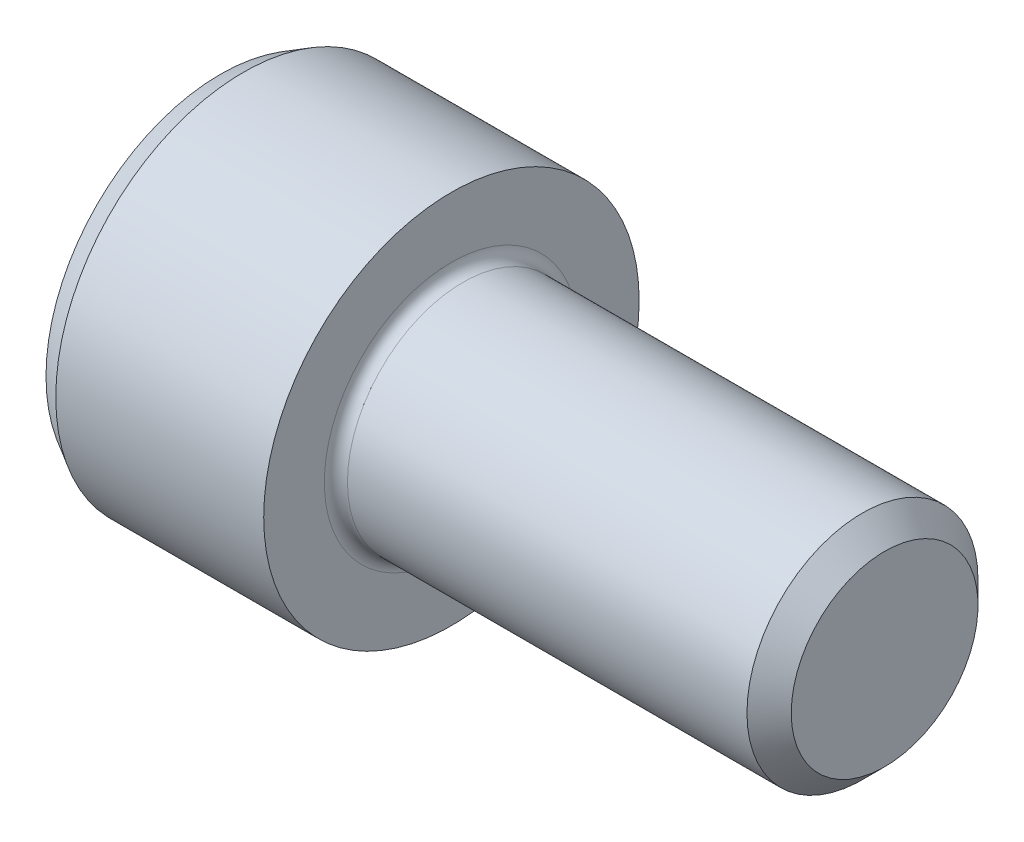
ISO-10303-21;
HEADER;
FILE_DESCRIPTION(('STEP AP214'),'2;1');
FILE_NAME('part.step','',(''),(''),'','','');
FILE_SCHEMA(('AUTOMOTIVE_DESIGN { 1 0 10303 214 1 1 1 1 }'));
ENDSEC;
DATA;
#1=APPLICATION_CONTEXT('core data for automotive mechanical design processes');
#2=APPLICATION_PROTOCOL_DEFINITION('international standard','automotive_design',2000,#1);
#3=PRODUCT_CONTEXT('',#1,'mechanical');
#4=PRODUCT('Part','Part','',(#3));
#5=PRODUCT_RELATED_PRODUCT_CATEGORY('part','',(#4));
#6=PRODUCT_DEFINITION_FORMATION('','',#4);
#7=PRODUCT_DEFINITION_CONTEXT('part definition',#1,'design');
#8=PRODUCT_DEFINITION('design','',#6,#7);
#9=PRODUCT_DEFINITION_SHAPE('','',#8);
#10=(LENGTH_UNIT() NAMED_UNIT(*) SI_UNIT(.MILLI.,.METRE.));
#11=(NAMED_UNIT(*) PLANE_ANGLE_UNIT() SI_UNIT($,.RADIAN.));
#12=(NAMED_UNIT(*) SI_UNIT($,.STERADIAN.) SOLID_ANGLE_UNIT());
#13=UNCERTAINTY_MEASURE_WITH_UNIT(LENGTH_MEASURE(1.E-05),#10,'distance_accuracy_value','');
#14=(GEOMETRIC_REPRESENTATION_CONTEXT(3) GLOBAL_UNCERTAINTY_ASSIGNED_CONTEXT((#13)) GLOBAL_UNIT_ASSIGNED_CONTEXT((#10,
#11,#12)) REPRESENTATION_CONTEXT('',''));
#15=CARTESIAN_POINT('',(0.,0.,0.));
#16=DIRECTION('',(0.,0.,1.));
#17=DIRECTION('',(1.,0.,0.));
#18=AXIS2_PLACEMENT_3D('',#15,#16,#17);
#19=CARTESIAN_POINT('',(-4.,0.,0.));
#20=DIRECTION('',(1.,0.,0.));
#21=DIRECTION('',(0.,0.,-1.));
#22=AXIS2_PLACEMENT_3D('',#19,#20,#21);
#23=PLANE('',#22);
#24=DIRECTION('',(0.,-0.500000000000001,-0.866025403784438));
#25=VECTOR('',#24,1.);
#26=CARTESIAN_POINT('',(-4.,-1.73205080756888,3.));
#27=LINE('',#26,#25);
#28=CARTESIAN_POINT('',(-4.,-1.73205080756888,3.));
#29=VERTEX_POINT('',#28);
#30=CARTESIAN_POINT('',(-4.00000000000193,-2.5980762113226,1.49999999998226));
#31=VERTEX_POINT('',#30);
#32=EDGE_CURVE('E92',#29,#31,#27,.T.);
#33=ORIENTED_EDGE('',*,*,#32,.F.);
#34=DIRECTION('',(0.,1.,0.));
#35=VECTOR('',#34,1.);
#36=CARTESIAN_POINT('',(-4.,0.,3.));
#37=LINE('',#36,#35);
#38=CARTESIAN_POINT('',(-4.00000000000193,0.,2.99999999996453));
#39=VERTEX_POINT('',#38);
#40=EDGE_CURVE('E88',#39,#29,#37,.F.);
#41=ORIENTED_EDGE('',*,*,#40,.F.);
#42=CARTESIAN_POINT('',(-4.00000000000387,0.,0.));
#43=DIRECTION('',(-1.,0.,0.));
#44=DIRECTION('',(0.,0.,1.));
#45=AXIS2_PLACEMENT_3D('',#42,#43,#44);
#46=CIRCLE('',#45,2.99999999992906);
#47=EDGE_CURVE('E19',#39,#31,#46,.F.);
#48=ORIENTED_EDGE('',*,*,#47,.T.);
#49=EDGE_LOOP('',(#33,#41,#48));
#50=FACE_BOUND('',#49,.T.);
#51=ADVANCED_FACE('F16',(#50),#23,.F.);
#52=CARTESIAN_POINT('',(-4.,0.,0.));
#53=DIRECTION('',(1.,0.,0.));
#54=DIRECTION('',(0.,0.,-1.));
#55=AXIS2_PLACEMENT_3D('',#52,#53,#54);
#56=PLANE('',#55);
#57=DIRECTION('',(0.,0.499999999999996,-0.866025403784441));
#58=VECTOR('',#57,1.);
#59=CARTESIAN_POINT('',(-4.,-3.46410161513775,0.));
#60=LINE('',#59,#58);
#61=CARTESIAN_POINT('',(-4.,-3.46410161513775,0.));
#62=VERTEX_POINT('',#61);
#63=CARTESIAN_POINT('',(-4.00000000000193,-2.5980762113226,-1.49999999998226));
#64=VERTEX_POINT('',#63);
#65=EDGE_CURVE('E150',#62,#64,#60,.T.);
#66=ORIENTED_EDGE('',*,*,#65,.F.);
#67=DIRECTION('',(0.,-0.499999999999996,-0.866025403784441));
#68=VECTOR('',#67,1.);
#69=CARTESIAN_POINT('',(-4.,-2.59807621135332,1.5));
#70=LINE('',#69,#68);
#71=EDGE_CURVE('E154',#31,#62,#70,.T.);
#72=ORIENTED_EDGE('',*,*,#71,.F.);
#73=CARTESIAN_POINT('',(-4.00000000000387,0.,0.));
#74=DIRECTION('',(-1.,0.,0.));
#75=DIRECTION('',(0.,0.,1.));
#76=AXIS2_PLACEMENT_3D('',#73,#74,#75);
#77=CIRCLE('',#76,2.99999999992906);
#78=EDGE_CURVE('E108',#31,#64,#77,.F.);
#79=ORIENTED_EDGE('',*,*,#78,.T.);
#80=EDGE_LOOP('',(#66,#72,#79));
#81=FACE_BOUND('',#80,.T.);
#82=ADVANCED_FACE('F210',(#81),#56,.F.);
#83=CARTESIAN_POINT('',(-4.,0.,0.));
#84=DIRECTION('',(1.,0.,0.));
#85=DIRECTION('',(0.,0.,-1.));
#86=AXIS2_PLACEMENT_3D('',#83,#84,#85);
#87=PLANE('',#86);
#88=DIRECTION('',(0.,1.,0.));
#89=VECTOR('',#88,1.);
#90=CARTESIAN_POINT('',(-4.,0.,-3.));
#91=LINE('',#90,#89);
#92=CARTESIAN_POINT('',(-4.,-1.73205080756888,-3.));
#93=VERTEX_POINT('',#92);
#94=CARTESIAN_POINT('',(-4.00000000000193,0.,-2.99999999996453));
#95=VERTEX_POINT('',#94);
#96=EDGE_CURVE('E142',#93,#95,#91,.T.);
#97=ORIENTED_EDGE('',*,*,#96,.F.);
#98=DIRECTION('',(0.,0.500000000000001,-0.866025403784438));
#99=VECTOR('',#98,1.);
#100=CARTESIAN_POINT('',(-4.,-2.59807621135332,-1.5));
#101=LINE('',#100,#99);
#102=EDGE_CURVE('E146',#64,#93,#101,.T.);
#103=ORIENTED_EDGE('',*,*,#102,.F.);
#104=CARTESIAN_POINT('',(-4.00000000000387,0.,0.));
#105=DIRECTION('',(-1.,0.,0.));
#106=DIRECTION('',(0.,0.,1.));
#107=AXIS2_PLACEMENT_3D('',#104,#105,#106);
#108=CIRCLE('',#107,2.99999999992906);
#109=EDGE_CURVE('E205',#64,#95,#108,.F.);
#110=ORIENTED_EDGE('',*,*,#109,.T.);
#111=EDGE_LOOP('',(#97,#103,#110));
#112=FACE_BOUND('',#111,.T.);
#113=ADVANCED_FACE('F213',(#112),#87,.F.);
#114=CARTESIAN_POINT('',(-4.,0.,0.));
#115=DIRECTION('',(1.,0.,0.));
#116=DIRECTION('',(0.,0.,-1.));
#117=AXIS2_PLACEMENT_3D('',#114,#115,#116);
#118=PLANE('',#117);
#119=DIRECTION('',(0.,0.500000000000001,0.866025403784438));
#120=VECTOR('',#119,1.);
#121=CARTESIAN_POINT('',(-4.,1.73205080756888,-3.));
#122=LINE('',#121,#120);
#123=CARTESIAN_POINT('',(-4.,1.73205080756888,-3.));
#124=VERTEX_POINT('',#123);
#125=CARTESIAN_POINT('',(-4.00000000000193,2.5980762113226,-1.49999999998226));
#126=VERTEX_POINT('',#125);
#127=EDGE_CURVE('E134',#124,#126,#122,.T.);
#128=ORIENTED_EDGE('',*,*,#127,.F.);
#129=DIRECTION('',(0.,1.,0.));
#130=VECTOR('',#129,1.);
#131=CARTESIAN_POINT('',(-4.,0.,-3.));
#132=LINE('',#131,#130);
#133=EDGE_CURVE('E138',#95,#124,#132,.T.);
#134=ORIENTED_EDGE('',*,*,#133,.F.);
#135=CARTESIAN_POINT('',(-4.00000000000387,0.,0.));
#136=DIRECTION('',(-1.,0.,0.));
#137=DIRECTION('',(0.,0.,1.));
#138=AXIS2_PLACEMENT_3D('',#135,#136,#137);
#139=CIRCLE('',#138,2.99999999992906);
#140=EDGE_CURVE('E202',#95,#126,#139,.F.);
#141=ORIENTED_EDGE('',*,*,#140,.T.);
#142=EDGE_LOOP('',(#128,#134,#141));
#143=FACE_BOUND('',#142,.T.);
#144=ADVANCED_FACE('F219',(#143),#118,.F.);
#145=CARTESIAN_POINT('',(-4.,0.,0.));
#146=DIRECTION('',(1.,0.,0.));
#147=DIRECTION('',(0.,0.,-1.));
#148=AXIS2_PLACEMENT_3D('',#145,#146,#147);
#149=PLANE('',#148);
#150=CARTESIAN_POINT('',(-4.00000000000387,0.,0.));
#151=DIRECTION('',(-1.,0.,0.));
#152=DIRECTION('',(0.,0.,1.));
#153=AXIS2_PLACEMENT_3D('',#150,#151,#152);
#154=CIRCLE('',#153,2.99999999992906);
#155=CARTESIAN_POINT('',(-4.00000000000193,2.5980762113226,1.49999999998226));
#156=VERTEX_POINT('',#155);
#157=EDGE_CURVE('E116',#126,#156,#154,.F.);
#158=ORIENTED_EDGE('',*,*,#157,.T.);
#159=DIRECTION('',(0.,-0.499999999999996,0.866025403784441));
#160=VECTOR('',#159,1.);
#161=CARTESIAN_POINT('',(-4.,3.46410161513775,0.));
#162=LINE('',#161,#160);
#163=CARTESIAN_POINT('',(-4.,3.46410161513775,0.));
#164=VERTEX_POINT('',#163);
#165=EDGE_CURVE('E130',#164,#156,#162,.T.);
#166=ORIENTED_EDGE('',*,*,#165,.F.);
#167=DIRECTION('',(0.,0.499999999999996,0.866025403784441));
#168=VECTOR('',#167,1.);
#169=CARTESIAN_POINT('',(-4.,2.59807621135332,-1.5));
#170=LINE('',#169,#168);
#171=EDGE_CURVE('E109',#126,#164,#170,.T.);
#172=ORIENTED_EDGE('',*,*,#171,.F.);
#173=EDGE_LOOP('',(#158,#166,#172));
#174=FACE_BOUND('',#173,.T.);
#175=ADVANCED_FACE('F222',(#174),#149,.F.);
#176=CARTESIAN_POINT('',(-3.99999999990541,0.,0.));
#177=DIRECTION('',(-1.,0.,0.));
#178=DIRECTION('',(0.,0.,1.));
#179=AXIS2_PLACEMENT_3D('',#176,#177,#178);
#180=CONICAL_SURFACE('',#179,2.99999999975853,1.04719755110019);
#181=CARTESIAN_POINT('',(-2.26794919240092,0.,-1.13686837721616E-10));
#182=VERTEX_POINT('',#181);
#183=VERTEX_LOOP('',#182);
#184=FACE_BOUND('',#183,.T.);
#185=ORIENTED_EDGE('',*,*,#140,.F.);
#186=ORIENTED_EDGE('',*,*,#109,.F.);
#187=ORIENTED_EDGE('',*,*,#78,.F.);
#188=ORIENTED_EDGE('',*,*,#47,.F.);
#189=CARTESIAN_POINT('',(-4.00000000000387,0.,0.));
#190=DIRECTION('',(-1.,0.,0.));
#191=DIRECTION('',(0.,0.,1.));
#192=AXIS2_PLACEMENT_3D('',#189,#190,#191);
#193=CIRCLE('',#192,2.99999999992906);
#194=EDGE_CURVE('E104',#39,#156,#193,.T.);
#195=ORIENTED_EDGE('',*,*,#194,.T.);
#196=ORIENTED_EDGE('',*,*,#157,.F.);
#197=EDGE_LOOP('',(#185,#186,#187,#188,#195,#196));
#198=FACE_BOUND('',#197,.T.);
#199=ADVANCED_FACE('F102',(#184,#198),#180,.F.);
#200=CARTESIAN_POINT('',(-4.,0.,0.));
#201=DIRECTION('',(1.,0.,0.));
#202=DIRECTION('',(0.,0.,-1.));
#203=AXIS2_PLACEMENT_3D('',#200,#201,#202);
#204=PLANE('',#203);
#205=DIRECTION('',(0.,1.,0.));
#206=VECTOR('',#205,1.);
#207=CARTESIAN_POINT('',(-4.,1.73205080756888,3.));
#208=LINE('',#207,#206);
#209=CARTESIAN_POINT('',(-4.,1.73205080756888,3.));
#210=VERTEX_POINT('',#209);
#211=EDGE_CURVE('E112',#210,#39,#208,.F.);
#212=ORIENTED_EDGE('',*,*,#211,.F.);
#213=DIRECTION('',(0.,0.5,-0.866025403784439));
#214=VECTOR('',#213,1.);
#215=CARTESIAN_POINT('',(-4.,3.46410161513775,0.));
#216=LINE('',#215,#214);
#217=EDGE_CURVE('E115',#156,#210,#216,.F.);
#218=ORIENTED_EDGE('',*,*,#217,.F.);
#219=ORIENTED_EDGE('',*,*,#194,.F.);
#220=EDGE_LOOP('',(#212,#218,#219));
#221=FACE_BOUND('',#220,.T.);
#222=ADVANCED_FACE('F111',(#221),#204,.F.);
#223=CARTESIAN_POINT('',(-4.,1.73205080756888,3.));
#224=DIRECTION('',(0.,0.,-1.));
#225=DIRECTION('',(-1.,0.,0.));
#226=AXIS2_PLACEMENT_3D('',#223,#224,#225);
#227=PLANE('',#226);
#228=ORIENTED_EDGE('',*,*,#40,.T.);
#229=DIRECTION('',(1.,0.,0.));
#230=VECTOR('',#229,1.);
#231=CARTESIAN_POINT('',(-4.,-1.73205080756888,3.));
#232=LINE('',#231,#230);
#233=CARTESIAN_POINT('',(-8.,-1.73205080756888,3.));
#234=VERTEX_POINT('',#233);
#235=EDGE_CURVE('E177',#234,#29,#232,.T.);
#236=ORIENTED_EDGE('',*,*,#235,.F.);
#237=DIRECTION('',(0.,1.,0.));
#238=VECTOR('',#237,1.);
#239=CARTESIAN_POINT('',(-8.,0.,3.));
#240=LINE('',#239,#238);
#241=CARTESIAN_POINT('',(-8.,1.73205080756888,3.));
#242=VERTEX_POINT('',#241);
#243=EDGE_CURVE('E182',#234,#242,#240,.T.);
#244=ORIENTED_EDGE('',*,*,#243,.T.);
#245=DIRECTION('',(1.,0.,0.));
#246=VECTOR('',#245,1.);
#247=CARTESIAN_POINT('',(-4.,1.73205080756887,3.));
#248=LINE('',#247,#246);
#249=EDGE_CURVE('E120',#210,#242,#248,.F.);
#250=ORIENTED_EDGE('',*,*,#249,.F.);
#251=ORIENTED_EDGE('',*,*,#211,.T.);
#252=EDGE_LOOP('',(#228,#236,#244,#250,#251));
#253=FACE_BOUND('',#252,.T.);
#254=ADVANCED_FACE('F118',(#253),#227,.T.);
#255=CARTESIAN_POINT('',(-4.,3.46410161513775,0.));
#256=DIRECTION('',(0.,-0.866025403784439,-0.5));
#257=DIRECTION('',(0.,0.5,-0.866025403784439));
#258=AXIS2_PLACEMENT_3D('',#255,#256,#257);
#259=PLANE('',#258);
#260=ORIENTED_EDGE('',*,*,#217,.T.);
#261=ORIENTED_EDGE('',*,*,#249,.T.);
#262=DIRECTION('',(0.,0.499999999999998,-0.86602540378444));
#263=VECTOR('',#262,1.);
#264=CARTESIAN_POINT('',(-8.,1.73205080756888,3.));
#265=LINE('',#264,#263);
#266=CARTESIAN_POINT('',(-8.,3.46410161513775,0.));
#267=VERTEX_POINT('',#266);
#268=EDGE_CURVE('E231',#242,#267,#265,.T.);
#269=ORIENTED_EDGE('',*,*,#268,.T.);
#270=DIRECTION('',(1.,0.,0.));
#271=VECTOR('',#270,1.);
#272=CARTESIAN_POINT('',(-4.,3.46410161513776,0.));
#273=LINE('',#272,#271);
#274=EDGE_CURVE('E165',#164,#267,#273,.F.);
#275=ORIENTED_EDGE('',*,*,#274,.F.);
#276=ORIENTED_EDGE('',*,*,#165,.T.);
#277=EDGE_LOOP('',(#260,#261,#269,#275,#276));
#278=FACE_BOUND('',#277,.T.);
#279=ADVANCED_FACE('F229',(#278),#259,.T.);
#280=CARTESIAN_POINT('',(-4.,1.73205080756888,-3.));
#281=DIRECTION('',(0.,-0.866025403784439,0.5));
#282=DIRECTION('',(0.,-0.5,-0.866025403784439));
#283=AXIS2_PLACEMENT_3D('',#280,#281,#282);
#284=PLANE('',#283);
#285=ORIENTED_EDGE('',*,*,#171,.T.);
#286=ORIENTED_EDGE('',*,*,#274,.T.);
#287=DIRECTION('',(0.,-0.499999999999998,-0.86602540378444));
#288=VECTOR('',#287,1.);
#289=CARTESIAN_POINT('',(-8.,3.46410161513775,0.));
#290=LINE('',#289,#288);
#291=CARTESIAN_POINT('',(-8.,1.73205080756888,-3.));
#292=VERTEX_POINT('',#291);
#293=EDGE_CURVE('E234',#267,#292,#290,.T.);
#294=ORIENTED_EDGE('',*,*,#293,.T.);
#295=DIRECTION('',(1.,0.,0.));
#296=VECTOR('',#295,1.);
#297=CARTESIAN_POINT('',(-4.,1.73205080756888,-3.));
#298=LINE('',#297,#296);
#299=EDGE_CURVE('E168',#124,#292,#298,.F.);
#300=ORIENTED_EDGE('',*,*,#299,.F.);
#301=ORIENTED_EDGE('',*,*,#127,.T.);
#302=EDGE_LOOP('',(#285,#286,#294,#300,#301));
#303=FACE_BOUND('',#302,.T.);
#304=ADVANCED_FACE('F225',(#303),#284,.T.);
#305=CARTESIAN_POINT('',(-4.,-1.73205080756888,-3.));
#306=DIRECTION('',(0.,0.,1.));
#307=DIRECTION('',(1.,0.,0.));
#308=AXIS2_PLACEMENT_3D('',#305,#306,#307);
#309=PLANE('',#308);
#310=ORIENTED_EDGE('',*,*,#133,.T.);
#311=ORIENTED_EDGE('',*,*,#299,.T.);
#312=DIRECTION('',(0.,1.,0.));
#313=VECTOR('',#312,1.);
#314=CARTESIAN_POINT('',(-8.,0.,-3.));
#315=LINE('',#314,#313);
#316=CARTESIAN_POINT('',(-8.,-1.73205080756888,-3.));
#317=VERTEX_POINT('',#316);
#318=EDGE_CURVE('E236',#292,#317,#315,.F.);
#319=ORIENTED_EDGE('',*,*,#318,.T.);
#320=DIRECTION('',(1.,0.,0.));
#321=VECTOR('',#320,1.);
#322=CARTESIAN_POINT('',(-4.,-1.73205080756887,-3.));
#323=LINE('',#322,#321);
#324=EDGE_CURVE('E173',#93,#317,#323,.F.);
#325=ORIENTED_EDGE('',*,*,#324,.F.);
#326=ORIENTED_EDGE('',*,*,#96,.T.);
#327=EDGE_LOOP('',(#310,#311,#319,#325,#326));
#328=FACE_BOUND('',#327,.T.);
#329=ADVANCED_FACE('F312',(#328),#309,.T.);
#330=CARTESIAN_POINT('',(-4.,-3.46410161513775,0.));
#331=DIRECTION('',(0.,0.866025403784439,0.5));
#332=DIRECTION('',(0.,-0.5,0.866025403784439));
#333=AXIS2_PLACEMENT_3D('',#330,#331,#332);
#334=PLANE('',#333);
#335=ORIENTED_EDGE('',*,*,#102,.T.);
#336=ORIENTED_EDGE('',*,*,#324,.T.);
#337=DIRECTION('',(0.,-0.499999999999998,0.86602540378444));
#338=VECTOR('',#337,1.);
#339=CARTESIAN_POINT('',(-8.,-1.73205080756888,-3.));
#340=LINE('',#339,#338);
#341=CARTESIAN_POINT('',(-8.,-3.46410161513775,0.));
#342=VERTEX_POINT('',#341);
#343=EDGE_CURVE('E34',#317,#342,#340,.T.);
#344=ORIENTED_EDGE('',*,*,#343,.T.);
#345=DIRECTION('',(1.,0.,0.));
#346=VECTOR('',#345,1.);
#347=CARTESIAN_POINT('',(-4.,-3.46410161513776,0.));
#348=LINE('',#347,#346);
#349=EDGE_CURVE('E180',#62,#342,#348,.F.);
#350=ORIENTED_EDGE('',*,*,#349,.F.);
#351=ORIENTED_EDGE('',*,*,#65,.T.);
#352=EDGE_LOOP('',(#335,#336,#344,#350,#351));
#353=FACE_BOUND('',#352,.T.);
#354=ADVANCED_FACE('F308',(#353),#334,.T.);
#355=CARTESIAN_POINT('',(-4.,-1.73205080756888,3.));
#356=DIRECTION('',(0.,0.866025403784439,-0.5));
#357=DIRECTION('',(0.,0.5,0.866025403784439));
#358=AXIS2_PLACEMENT_3D('',#355,#356,#357);
#359=PLANE('',#358);
#360=ORIENTED_EDGE('',*,*,#71,.T.);
#361=ORIENTED_EDGE('',*,*,#349,.T.);
#362=DIRECTION('',(0.,0.499999999999998,0.86602540378444));
#363=VECTOR('',#362,1.);
#364=CARTESIAN_POINT('',(-8.,-3.46410161513775,0.));
#365=LINE('',#364,#363);
#366=EDGE_CURVE('E198',#342,#234,#365,.T.);
#367=ORIENTED_EDGE('',*,*,#366,.T.);
#368=ORIENTED_EDGE('',*,*,#235,.T.);
#369=ORIENTED_EDGE('',*,*,#32,.T.);
#370=EDGE_LOOP('',(#360,#361,#367,#368,#369));
#371=FACE_BOUND('',#370,.T.);
#372=ADVANCED_FACE('F305',(#371),#359,.T.);
#373=CARTESIAN_POINT('',(-8.,0.,0.));
#374=DIRECTION('',(1.,0.,0.));
#375=DIRECTION('',(0.,0.,-1.));
#376=AXIS2_PLACEMENT_3D('',#373,#374,#375);
#377=PLANE('',#376);
#378=ORIENTED_EDGE('',*,*,#343,.F.);
#379=ORIENTED_EDGE('',*,*,#318,.F.);
#380=ORIENTED_EDGE('',*,*,#293,.F.);
#381=ORIENTED_EDGE('',*,*,#268,.F.);
#382=ORIENTED_EDGE('',*,*,#243,.F.);
#383=ORIENTED_EDGE('',*,*,#366,.F.);
#384=EDGE_LOOP('',(#378,#379,#380,#381,#382,#383));
#385=FACE_BOUND('',#384,.T.);
#386=CARTESIAN_POINT('',(-8.0000000000382,0.,0.));
#387=DIRECTION('',(1.,0.,0.));
#388=DIRECTION('',(0.,0.,-1.));
#389=AXIS2_PLACEMENT_3D('',#386,#387,#388);
#390=CIRCLE('',#389,6.03811978457611);
#391=CARTESIAN_POINT('',(-8.0000000000382,0.,-6.03811978457611));
#392=VERTEX_POINT('',#391);
#393=EDGE_CURVE('E196',#392,#392,#390,.T.);
#394=ORIENTED_EDGE('',*,*,#393,.F.);
#395=EDGE_LOOP('',(#394));
#396=FACE_BOUND('',#395,.T.);
#397=ADVANCED_FACE('F301',(#385,#396),#377,.F.);
#398=CARTESIAN_POINT('',(-7.20000000018217,0.,0.));
#399=DIRECTION('',(1.,0.,0.));
#400=DIRECTION('',(0.,0.,-1.));
#401=AXIS2_PLACEMENT_3D('',#398,#399,#400);
#402=CONICAL_SURFACE('',#401,6.4999999998463,0.523598775599803);
#403=ORIENTED_EDGE('',*,*,#393,.T.);
#404=EDGE_LOOP('',(#403));
#405=FACE_BOUND('',#404,.T.);
#406=CARTESIAN_POINT('',(-7.20000000000002,0.,0.));
#407=DIRECTION('',(-1.,0.,0.));
#408=DIRECTION('',(0.,0.,1.));
#409=AXIS2_PLACEMENT_3D('',#406,#407,#408);
#410=CIRCLE('',#409,6.5);
#411=CARTESIAN_POINT('',(-7.20000000000002,0.,6.5));
#412=VERTEX_POINT('',#411);
#413=EDGE_CURVE('E195',#412,#412,#410,.F.);
#414=ORIENTED_EDGE('',*,*,#413,.F.);
#415=EDGE_LOOP('',(#414));
#416=FACE_BOUND('',#415,.T.);
#417=ADVANCED_FACE('F297',(#405,#416),#402,.T.);
#418=CARTESIAN_POINT('',(15.,0.,0.));
#419=DIRECTION('',(-1.,0.,0.));
#420=DIRECTION('',(0.,0.,1.));
#421=AXIS2_PLACEMENT_3D('',#418,#419,#420);
#422=CYLINDRICAL_SURFACE('',#421,6.5);
#423=ORIENTED_EDGE('',*,*,#413,.T.);
#424=EDGE_LOOP('',(#423));
#425=FACE_BOUND('',#424,.T.);
#426=CARTESIAN_POINT('',(0.,0.,0.));
#427=DIRECTION('',(-1.,0.,0.));
#428=DIRECTION('',(0.,0.,1.));
#429=AXIS2_PLACEMENT_3D('',#426,#427,#428);
#430=CIRCLE('',#429,6.5);
#431=CARTESIAN_POINT('',(0.,0.,6.5));
#432=VERTEX_POINT('',#431);
#433=EDGE_CURVE('E192',#432,#432,#430,.T.);
#434=ORIENTED_EDGE('',*,*,#433,.T.);
#435=EDGE_LOOP('',(#434));
#436=FACE_BOUND('',#435,.T.);
#437=ADVANCED_FACE('F293',(#425,#436),#422,.T.);
#438=CARTESIAN_POINT('',(15.,3.233,0.));
#439=DIRECTION('',(-1.,0.,0.));
#440=DIRECTION('',(0.,0.,1.));
#441=AXIS2_PLACEMENT_3D('',#438,#439,#440);
#442=PLANE('',#441);
#443=CARTESIAN_POINT('',(14.9999999999864,0.,0.));
#444=DIRECTION('',(-1.,0.,0.));
#445=DIRECTION('',(0.,0.,1.));
#446=AXIS2_PLACEMENT_3D('',#443,#444,#445);
#447=CIRCLE('',#446,3.23299999996607);
#448=CARTESIAN_POINT('',(14.9999999999864,0.,3.23299999996607));
#449=VERTEX_POINT('',#448);
#450=EDGE_CURVE('E188',#449,#449,#447,.T.);
#451=ORIENTED_EDGE('',*,*,#450,.F.);
#452=EDGE_LOOP('',(#451));
#453=FACE_BOUND('',#452,.T.);
#454=ADVANCED_FACE('F289',(#453),#442,.F.);
#455=CARTESIAN_POINT('',(0.,6.5,0.));
#456=DIRECTION('',(-1.,0.,0.));
#457=DIRECTION('',(0.,0.,1.));
#458=AXIS2_PLACEMENT_3D('',#455,#456,#457);
#459=PLANE('',#458);
#460=ORIENTED_EDGE('',*,*,#433,.F.);
#461=EDGE_LOOP('',(#460));
#462=FACE_BOUND('',#461,.T.);
#463=CARTESIAN_POINT('',(0.,0.,0.));
#464=DIRECTION('',(1.,0.,0.));
#465=DIRECTION('',(0.,0.,-1.));
#466=AXIS2_PLACEMENT_3D('',#463,#464,#465);
#467=CIRCLE('',#466,4.4);
#468=CARTESIAN_POINT('',(0.,0.,-4.4));
#469=VERTEX_POINT('',#468);
#470=EDGE_CURVE('E191',#469,#469,#467,.F.);
#471=ORIENTED_EDGE('',*,*,#470,.T.);
#472=EDGE_LOOP('',(#471));
#473=FACE_BOUND('',#472,.T.);
#474=ADVANCED_FACE('F280',(#462,#473),#459,.F.);
#475=CARTESIAN_POINT('',(14.233000000047,0.,0.));
#476=DIRECTION('',(-1.,0.,0.));
#477=DIRECTION('',(0.,0.,1.));
#478=AXIS2_PLACEMENT_3D('',#475,#476,#477);
#479=CONICAL_SURFACE('',#478,3.99999999990541,0.785398163397448);
#480=CARTESIAN_POINT('',(14.233,0.,0.));
#481=DIRECTION('',(-1.,0.,0.));
#482=DIRECTION('',(0.,0.,1.));
#483=AXIS2_PLACEMENT_3D('',#480,#481,#482);
#484=CIRCLE('',#483,4.);
#485=CARTESIAN_POINT('',(14.233,0.,4.));
#486=VERTEX_POINT('',#485);
#487=EDGE_CURVE('E25',#486,#486,#484,.T.);
#488=ORIENTED_EDGE('',*,*,#487,.F.);
#489=EDGE_LOOP('',(#488));
#490=FACE_BOUND('',#489,.T.);
#491=ORIENTED_EDGE('',*,*,#450,.T.);
#492=EDGE_LOOP('',(#491));
#493=FACE_BOUND('',#492,.T.);
#494=ADVANCED_FACE('F268',(#490,#493),#479,.T.);
#495=CARTESIAN_POINT('',(0.400000000000001,0.,0.));
#496=DIRECTION('',(1.,0.,0.));
#497=DIRECTION('',(0.,0.,-1.));
#498=AXIS2_PLACEMENT_3D('',#495,#496,#497);
#499=TOROIDAL_SURFACE('',#498,4.4,0.400000000000001);
#500=ORIENTED_EDGE('',*,*,#470,.F.);
#501=EDGE_LOOP('',(#500));
#502=FACE_BOUND('',#501,.T.);
#503=CARTESIAN_POINT('',(0.400000000000001,0.,0.));
#504=DIRECTION('',(-1.,0.,0.));
#505=DIRECTION('',(0.,0.,1.));
#506=AXIS2_PLACEMENT_3D('',#503,#504,#505);
#507=CIRCLE('',#506,4.);
#508=CARTESIAN_POINT('',(0.400000000000001,0.,4.));
#509=VERTEX_POINT('',#508);
#510=EDGE_CURVE('E11',#509,#509,#507,.F.);
#511=ORIENTED_EDGE('',*,*,#510,.F.);
#512=EDGE_LOOP('',(#511));
#513=FACE_BOUND('',#512,.T.);
#514=ADVANCED_FACE('F256',(#502,#513),#499,.F.);
#515=CARTESIAN_POINT('',(15.,0.,0.));
#516=DIRECTION('',(-1.,0.,0.));
#517=DIRECTION('',(0.,0.,1.));
#518=AXIS2_PLACEMENT_3D('',#515,#516,#517);
#519=CYLINDRICAL_SURFACE('',#518,4.);
#520=ORIENTED_EDGE('',*,*,#510,.T.);
#521=EDGE_LOOP('',(#520));
#522=FACE_BOUND('',#521,.T.);
#523=ORIENTED_EDGE('',*,*,#487,.T.);
#524=EDGE_LOOP('',(#523));
#525=FACE_BOUND('',#524,.T.);
#526=ADVANCED_FACE('F267',(#522,#525),#519,.T.);
#527=CLOSED_SHELL('',(#51,#82,#113,#144,#175,#199,#222,#254,#279,#304,#329,#354,#372,#397,#417,
#437,#454,#474,#494,#514,#526));
#528=MANIFOLD_SOLID_BREP('B1',#527);
#529=ADVANCED_BREP_SHAPE_REPRESENTATION('',(#18,#528),#14);
#530=SHAPE_DEFINITION_REPRESENTATION(#9,#529);
ENDSEC;
END-ISO-10303-21;
